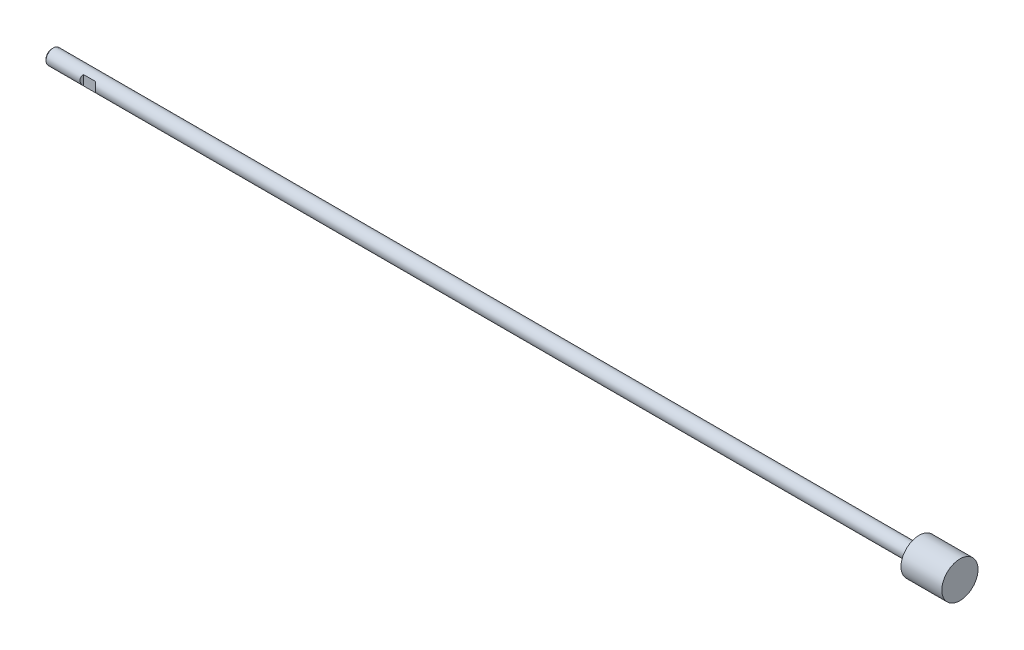
ISO-10303-21;
HEADER;
FILE_DESCRIPTION(('STEP AP214'),'2;1');
FILE_NAME('part.step','',(''),(''),'','','');
FILE_SCHEMA(('AUTOMOTIVE_DESIGN { 1 0 10303 214 1 1 1 1 }'));
ENDSEC;
DATA;
#1=APPLICATION_CONTEXT('core data for automotive mechanical design processes');
#2=APPLICATION_PROTOCOL_DEFINITION('international standard','automotive_design',2000,#1);
#3=PRODUCT_CONTEXT('',#1,'mechanical');
#4=PRODUCT('Part','Part','',(#3));
#5=PRODUCT_RELATED_PRODUCT_CATEGORY('part','',(#4));
#6=PRODUCT_DEFINITION_FORMATION('','',#4);
#7=PRODUCT_DEFINITION_CONTEXT('part definition',#1,'design');
#8=PRODUCT_DEFINITION('design','',#6,#7);
#9=PRODUCT_DEFINITION_SHAPE('','',#8);
#10=(LENGTH_UNIT() NAMED_UNIT(*) SI_UNIT(.MILLI.,.METRE.));
#11=(NAMED_UNIT(*) PLANE_ANGLE_UNIT() SI_UNIT($,.RADIAN.));
#12=(NAMED_UNIT(*) SI_UNIT($,.STERADIAN.) SOLID_ANGLE_UNIT());
#13=UNCERTAINTY_MEASURE_WITH_UNIT(LENGTH_MEASURE(1.E-05),#10,'distance_accuracy_value','');
#14=(GEOMETRIC_REPRESENTATION_CONTEXT(3) GLOBAL_UNCERTAINTY_ASSIGNED_CONTEXT((#13)) GLOBAL_UNIT_ASSIGNED_CONTEXT((#10,
#11,#12)) REPRESENTATION_CONTEXT('',''));
#15=CARTESIAN_POINT('',(0.,0.,0.));
#16=DIRECTION('',(0.,0.,1.));
#17=DIRECTION('',(1.,0.,0.));
#18=AXIS2_PLACEMENT_3D('',#15,#16,#17);
#19=CARTESIAN_POINT('',(0.,0.,0.));
#20=DIRECTION('',(1.,0.,0.));
#21=DIRECTION('',(0.,0.,-1.));
#22=AXIS2_PLACEMENT_3D('',#19,#20,#21);
#23=PLANE('',#22);
#24=CARTESIAN_POINT('',(0.,0.,0.));
#25=DIRECTION('',(-1.,0.,0.));
#26=DIRECTION('',(0.,0.,1.));
#27=AXIS2_PLACEMENT_3D('',#24,#25,#26);
#28=CIRCLE('',#27,3.233);
#29=CARTESIAN_POINT('',(0.,0.,3.233));
#30=VERTEX_POINT('',#29);
#31=EDGE_CURVE('E83',#30,#30,#28,.T.);
#32=ORIENTED_EDGE('',*,*,#31,.T.);
#33=EDGE_LOOP('',(#32));
#34=FACE_BOUND('',#33,.T.);
#35=ADVANCED_FACE('F39',(#34),#23,.F.);
#36=CARTESIAN_POINT('',(0.767000000000018,0.,0.));
#37=DIRECTION('',(1.,0.,0.));
#38=DIRECTION('',(0.,0.,-1.));
#39=AXIS2_PLACEMENT_3D('',#36,#37,#38);
#40=CONICAL_SURFACE('',#39,4.,0.785398163397437);
#41=ORIENTED_EDGE('',*,*,#31,.F.);
#42=EDGE_LOOP('',(#41));
#43=FACE_BOUND('',#42,.T.);
#44=CARTESIAN_POINT('',(0.767000000000018,0.,0.));
#45=DIRECTION('',(-1.,0.,0.));
#46=DIRECTION('',(0.,0.,1.));
#47=AXIS2_PLACEMENT_3D('',#44,#45,#46);
#48=CIRCLE('',#47,4.);
#49=CARTESIAN_POINT('',(0.767000000000018,0.,4.));
#50=VERTEX_POINT('',#49);
#51=EDGE_CURVE('E128',#50,#50,#48,.T.);
#52=ORIENTED_EDGE('',*,*,#51,.T.);
#53=EDGE_LOOP('',(#52));
#54=FACE_BOUND('',#53,.T.);
#55=ADVANCED_FACE('F134',(#43,#54),#40,.T.);
#56=CARTESIAN_POINT('',(489.,0.,0.));
#57=DIRECTION('',(-1.,0.,0.));
#58=DIRECTION('',(0.,0.,1.));
#59=AXIS2_PLACEMENT_3D('',#56,#57,#58);
#60=CYLINDRICAL_SURFACE('',#59,4.);
#61=DIRECTION('',(-1.,0.,0.));
#62=VECTOR('',#61,1.);
#63=CARTESIAN_POINT('',(489.,-2.64575131106459,-3.));
#64=LINE('',#63,#62);
#65=CARTESIAN_POINT('',(20.,-2.64575131106458,-3.));
#66=VERTEX_POINT('',#65);
#67=CARTESIAN_POINT('',(26.4,-2.64575131106459,-3.));
#68=VERTEX_POINT('',#67);
#69=EDGE_CURVE('E104',#66,#68,#64,.F.);
#70=ORIENTED_EDGE('',*,*,#69,.T.);
#71=CARTESIAN_POINT('',(23.4,0.,0.));
#72=DIRECTION('',(0.707106781186548,0.,0.707106781186548));
#73=DIRECTION('',(-0.707106781186548,0.,0.707106781186548));
#74=AXIS2_PLACEMENT_3D('',#71,#72,#73);
#75=ELLIPSE('',#74,5.65685424949238,4.);
#76=CARTESIAN_POINT('',(26.4,2.64575131106459,-3.));
#77=VERTEX_POINT('',#76);
#78=EDGE_CURVE('E11',#68,#77,#75,.T.);
#79=ORIENTED_EDGE('',*,*,#78,.T.);
#80=DIRECTION('',(-1.,0.,0.));
#81=VECTOR('',#80,1.);
#82=CARTESIAN_POINT('',(489.,2.64575131106459,-3.));
#83=LINE('',#82,#81);
#84=CARTESIAN_POINT('',(20.,2.64575131106458,-3.));
#85=VERTEX_POINT('',#84);
#86=EDGE_CURVE('E46',#77,#85,#83,.T.);
#87=ORIENTED_EDGE('',*,*,#86,.T.);
#88=CARTESIAN_POINT('',(23.,0.,0.));
#89=DIRECTION('',(-0.707106781186548,0.,0.707106781186547));
#90=DIRECTION('',(-0.707106781186547,0.,-0.707106781186548));
#91=AXIS2_PLACEMENT_3D('',#88,#89,#90);
#92=ELLIPSE('',#91,5.65685424949238,4.);
#93=EDGE_CURVE('E101',#85,#66,#92,.T.);
#94=ORIENTED_EDGE('',*,*,#93,.T.);
#95=EDGE_LOOP('',(#70,#79,#87,#94));
#96=FACE_BOUND('',#95,.T.);
#97=DIRECTION('',(-1.,0.,0.));
#98=VECTOR('',#97,1.);
#99=CARTESIAN_POINT('',(489.,-2.64575131106459,3.));
#100=LINE('',#99,#98);
#101=CARTESIAN_POINT('',(26.4,-2.64575131106458,3.));
#102=VERTEX_POINT('',#101);
#103=CARTESIAN_POINT('',(20.,-2.64575131106459,3.));
#104=VERTEX_POINT('',#103);
#105=EDGE_CURVE('E89',#102,#104,#100,.T.);
#106=ORIENTED_EDGE('',*,*,#105,.T.);
#107=CARTESIAN_POINT('',(23.0000000000001,0.,0.));
#108=DIRECTION('',(-0.707106781186547,0.,-0.707106781186548));
#109=DIRECTION('',(-0.707106781186548,0.,0.707106781186547));
#110=AXIS2_PLACEMENT_3D('',#107,#108,#109);
#111=ELLIPSE('',#110,5.65685424949239,4.);
#112=CARTESIAN_POINT('',(20.,2.64575131106459,3.));
#113=VERTEX_POINT('',#112);
#114=EDGE_CURVE('E95',#104,#113,#111,.T.);
#115=ORIENTED_EDGE('',*,*,#114,.T.);
#116=DIRECTION('',(-1.,0.,0.));
#117=VECTOR('',#116,1.);
#118=CARTESIAN_POINT('',(489.,2.64575131106459,3.));
#119=LINE('',#118,#117);
#120=CARTESIAN_POINT('',(26.4,2.64575131106458,3.));
#121=VERTEX_POINT('',#120);
#122=EDGE_CURVE('E82',#113,#121,#119,.F.);
#123=ORIENTED_EDGE('',*,*,#122,.T.);
#124=CARTESIAN_POINT('',(23.4,0.,0.));
#125=DIRECTION('',(0.707106781186548,0.,-0.707106781186548));
#126=DIRECTION('',(-0.707106781186548,0.,-0.707106781186548));
#127=AXIS2_PLACEMENT_3D('',#124,#125,#126);
#128=ELLIPSE('',#127,5.65685424949238,4.);
#129=EDGE_CURVE('E77',#121,#102,#128,.T.);
#130=ORIENTED_EDGE('',*,*,#129,.T.);
#131=EDGE_LOOP('',(#106,#115,#123,#130));
#132=FACE_BOUND('',#131,.T.);
#133=ORIENTED_EDGE('',*,*,#51,.F.);
#134=EDGE_LOOP('',(#133));
#135=FACE_BOUND('',#134,.T.);
#136=CARTESIAN_POINT('',(467.,0.,0.));
#137=DIRECTION('',(-1.,0.,0.));
#138=DIRECTION('',(0.,0.,1.));
#139=AXIS2_PLACEMENT_3D('',#136,#137,#138);
#140=CIRCLE('',#139,4.);
#141=CARTESIAN_POINT('',(467.,0.,4.));
#142=VERTEX_POINT('',#141);
#143=EDGE_CURVE('E125',#142,#142,#140,.T.);
#144=ORIENTED_EDGE('',*,*,#143,.T.);
#145=EDGE_LOOP('',(#144));
#146=FACE_BOUND('',#145,.T.);
#147=ADVANCED_FACE('F93',(#96,#132,#135,#146),#60,.T.);
#148=CARTESIAN_POINT('',(467.,4.,0.));
#149=DIRECTION('',(1.,0.,0.));
#150=DIRECTION('',(0.,0.,-1.));
#151=AXIS2_PLACEMENT_3D('',#148,#149,#150);
#152=PLANE('',#151);
#153=ORIENTED_EDGE('',*,*,#143,.F.);
#154=EDGE_LOOP('',(#153));
#155=FACE_BOUND('',#154,.T.);
#156=CARTESIAN_POINT('',(467.,0.,0.));
#157=DIRECTION('',(-1.,0.,0.));
#158=DIRECTION('',(0.,0.,1.));
#159=AXIS2_PLACEMENT_3D('',#156,#157,#158);
#160=CIRCLE('',#159,9.75);
#161=CARTESIAN_POINT('',(467.,0.,9.75));
#162=VERTEX_POINT('',#161);
#163=EDGE_CURVE('E118',#162,#162,#160,.T.);
#164=ORIENTED_EDGE('',*,*,#163,.T.);
#165=EDGE_LOOP('',(#164));
#166=FACE_BOUND('',#165,.T.);
#167=ADVANCED_FACE('F140',(#155,#166),#152,.F.);
#168=CARTESIAN_POINT('',(489.,0.,0.));
#169=DIRECTION('',(-1.,0.,0.));
#170=DIRECTION('',(0.,0.,1.));
#171=AXIS2_PLACEMENT_3D('',#168,#169,#170);
#172=CYLINDRICAL_SURFACE('',#171,9.75);
#173=ORIENTED_EDGE('',*,*,#163,.F.);
#174=EDGE_LOOP('',(#173));
#175=FACE_BOUND('',#174,.T.);
#176=CARTESIAN_POINT('',(489.,0.,0.));
#177=DIRECTION('',(-1.,0.,0.));
#178=DIRECTION('',(0.,0.,1.));
#179=AXIS2_PLACEMENT_3D('',#176,#177,#178);
#180=CIRCLE('',#179,9.75);
#181=CARTESIAN_POINT('',(489.,0.,9.75));
#182=VERTEX_POINT('',#181);
#183=EDGE_CURVE('E115',#182,#182,#180,.T.);
#184=ORIENTED_EDGE('',*,*,#183,.T.);
#185=EDGE_LOOP('',(#184));
#186=FACE_BOUND('',#185,.T.);
#187=ADVANCED_FACE('F146',(#175,#186),#172,.T.);
#188=CARTESIAN_POINT('',(489.,9.75,0.));
#189=DIRECTION('',(-1.,0.,0.));
#190=DIRECTION('',(0.,0.,1.));
#191=AXIS2_PLACEMENT_3D('',#188,#189,#190);
#192=PLANE('',#191);
#193=ORIENTED_EDGE('',*,*,#183,.F.);
#194=EDGE_LOOP('',(#193));
#195=FACE_BOUND('',#194,.T.);
#196=ADVANCED_FACE('F152',(#195),#192,.F.);
#197=CARTESIAN_POINT('',(35.4,-3.,12.));
#198=DIRECTION('',(0.707106781186548,0.,-0.707106781186548));
#199=DIRECTION('',(-0.707106781186548,0.,-0.707106781186548));
#200=AXIS2_PLACEMENT_3D('',#197,#198,#199);
#201=PLANE('',#200);
#202=DIRECTION('',(0.,1.,0.));
#203=VECTOR('',#202,1.);
#204=CARTESIAN_POINT('',(26.4,-3.,3.));
#205=LINE('',#204,#203);
#206=EDGE_CURVE('E59',#102,#121,#205,.T.);
#207=ORIENTED_EDGE('',*,*,#206,.F.);
#208=ORIENTED_EDGE('',*,*,#129,.F.);
#209=EDGE_LOOP('',(#207,#208));
#210=FACE_BOUND('',#209,.T.);
#211=ADVANCED_FACE('F78',(#210),#201,.F.);
#212=CARTESIAN_POINT('',(26.4,-3.,3.));
#213=DIRECTION('',(0.,0.,-1.));
#214=DIRECTION('',(-1.,0.,0.));
#215=AXIS2_PLACEMENT_3D('',#212,#213,#214);
#216=PLANE('',#215);
#217=ORIENTED_EDGE('',*,*,#206,.T.);
#218=ORIENTED_EDGE('',*,*,#122,.F.);
#219=DIRECTION('',(0.,1.,0.));
#220=VECTOR('',#219,1.);
#221=CARTESIAN_POINT('',(20.,-3.,3.));
#222=LINE('',#221,#220);
#223=EDGE_CURVE('E90',#104,#113,#222,.T.);
#224=ORIENTED_EDGE('',*,*,#223,.F.);
#225=ORIENTED_EDGE('',*,*,#105,.F.);
#226=EDGE_LOOP('',(#217,#218,#224,#225));
#227=FACE_BOUND('',#226,.T.);
#228=ADVANCED_FACE('F86',(#227),#216,.F.);
#229=CARTESIAN_POINT('',(20.,-3.,3.));
#230=DIRECTION('',(-0.707106781186547,0.,-0.707106781186548));
#231=DIRECTION('',(-0.707106781186548,0.,0.707106781186547));
#232=AXIS2_PLACEMENT_3D('',#229,#230,#231);
#233=PLANE('',#232);
#234=ORIENTED_EDGE('',*,*,#223,.T.);
#235=ORIENTED_EDGE('',*,*,#114,.F.);
#236=EDGE_LOOP('',(#234,#235));
#237=FACE_BOUND('',#236,.T.);
#238=ADVANCED_FACE('F213',(#237),#233,.F.);
#239=CARTESIAN_POINT('',(26.4,-3.,-3.));
#240=DIRECTION('',(0.707106781186548,0.,0.707106781186548));
#241=DIRECTION('',(0.707106781186548,0.,-0.707106781186548));
#242=AXIS2_PLACEMENT_3D('',#239,#240,#241);
#243=PLANE('',#242);
#244=DIRECTION('',(0.,1.,0.));
#245=VECTOR('',#244,1.);
#246=CARTESIAN_POINT('',(26.4,-3.,-3.));
#247=LINE('',#246,#245);
#248=EDGE_CURVE('E112',#68,#77,#247,.T.);
#249=ORIENTED_EDGE('',*,*,#248,.T.);
#250=ORIENTED_EDGE('',*,*,#78,.F.);
#251=EDGE_LOOP('',(#249,#250));
#252=FACE_BOUND('',#251,.T.);
#253=ADVANCED_FACE('F114',(#252),#243,.F.);
#254=CARTESIAN_POINT('',(20.,-3.,-3.));
#255=DIRECTION('',(0.,0.,1.));
#256=DIRECTION('',(1.,0.,0.));
#257=AXIS2_PLACEMENT_3D('',#254,#255,#256);
#258=PLANE('',#257);
#259=ORIENTED_EDGE('',*,*,#248,.F.);
#260=ORIENTED_EDGE('',*,*,#69,.F.);
#261=DIRECTION('',(0.,1.,0.));
#262=VECTOR('',#261,1.);
#263=CARTESIAN_POINT('',(20.,-3.,-3.));
#264=LINE('',#263,#262);
#265=EDGE_CURVE('E52',#66,#85,#264,.T.);
#266=ORIENTED_EDGE('',*,*,#265,.T.);
#267=ORIENTED_EDGE('',*,*,#86,.F.);
#268=EDGE_LOOP('',(#259,#260,#266,#267));
#269=FACE_BOUND('',#268,.T.);
#270=ADVANCED_FACE('F111',(#269),#258,.F.);
#271=CARTESIAN_POINT('',(18.,-3.,-5.));
#272=DIRECTION('',(-0.707106781186548,0.,0.707106781186547));
#273=DIRECTION('',(0.707106781186547,0.,0.707106781186548));
#274=AXIS2_PLACEMENT_3D('',#271,#272,#273);
#275=PLANE('',#274);
#276=ORIENTED_EDGE('',*,*,#265,.F.);
#277=ORIENTED_EDGE('',*,*,#93,.F.);
#278=EDGE_LOOP('',(#276,#277));
#279=FACE_BOUND('',#278,.T.);
#280=ADVANCED_FACE('F242',(#279),#275,.F.);
#281=CLOSED_SHELL('',(#35,#55,#147,#167,#187,#196,#211,#228,#238,#253,#270,#280));
#282=MANIFOLD_SOLID_BREP('B2',#281);
#283=ADVANCED_BREP_SHAPE_REPRESENTATION('',(#18,#282),#14);
#284=SHAPE_DEFINITION_REPRESENTATION(#9,#283);
ENDSEC;
END-ISO-10303-21;
